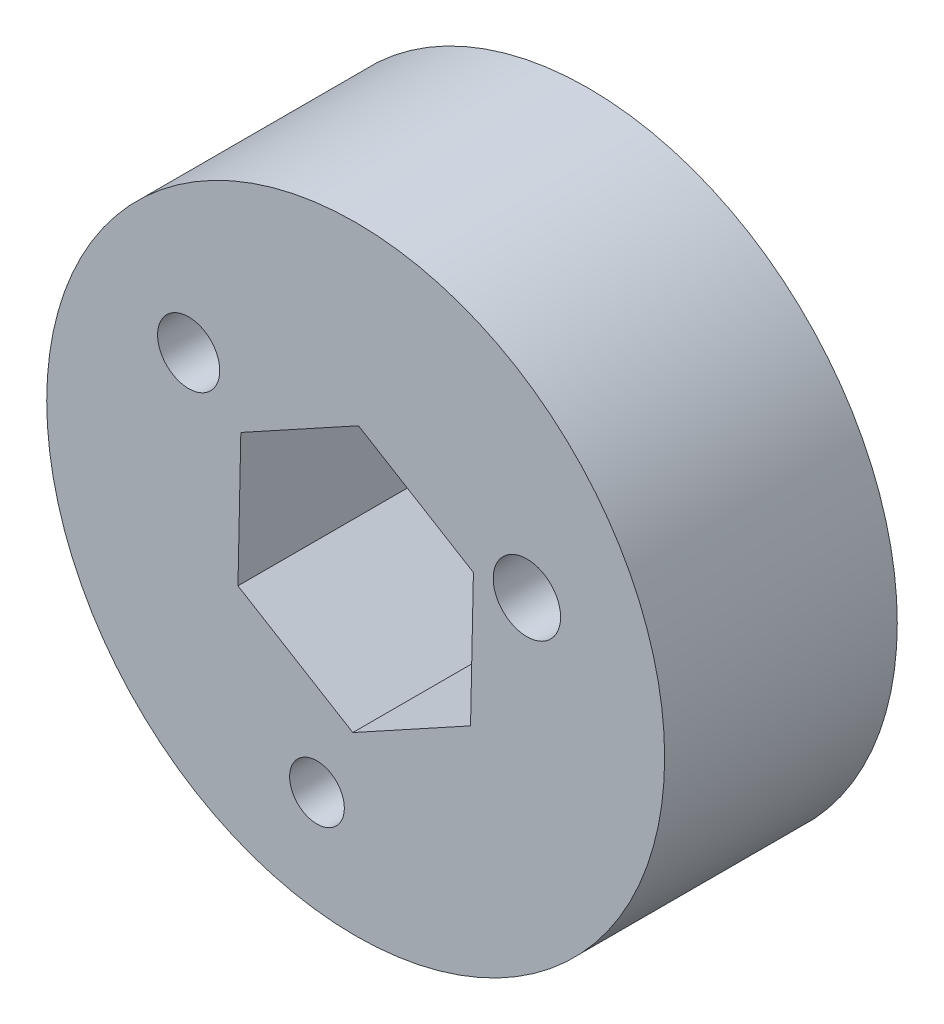
ISO-10303-21;
HEADER;
FILE_DESCRIPTION(('STEP AP214'),'2;1');
FILE_NAME('part.step','',(''),(''),'','','');
FILE_SCHEMA(('AUTOMOTIVE_DESIGN { 1 0 10303 214 1 1 1 1 }'));
ENDSEC;
DATA;
#1=APPLICATION_CONTEXT('core data for automotive mechanical design processes');
#2=APPLICATION_PROTOCOL_DEFINITION('international standard','automotive_design',2000,#1);
#3=PRODUCT_CONTEXT('',#1,'mechanical');
#4=PRODUCT('Part','Part','',(#3));
#5=PRODUCT_RELATED_PRODUCT_CATEGORY('part','',(#4));
#6=PRODUCT_DEFINITION_FORMATION('','',#4);
#7=PRODUCT_DEFINITION_CONTEXT('part definition',#1,'design');
#8=PRODUCT_DEFINITION('design','',#6,#7);
#9=PRODUCT_DEFINITION_SHAPE('','',#8);
#10=(LENGTH_UNIT() NAMED_UNIT(*) SI_UNIT(.MILLI.,.METRE.));
#11=(NAMED_UNIT(*) PLANE_ANGLE_UNIT() SI_UNIT($,.RADIAN.));
#12=(NAMED_UNIT(*) SI_UNIT($,.STERADIAN.) SOLID_ANGLE_UNIT());
#13=UNCERTAINTY_MEASURE_WITH_UNIT(LENGTH_MEASURE(1.E-05),#10,'distance_accuracy_value','');
#14=(GEOMETRIC_REPRESENTATION_CONTEXT(3) GLOBAL_UNCERTAINTY_ASSIGNED_CONTEXT((#13)) GLOBAL_UNIT_ASSIGNED_CONTEXT((#10,
#11,#12)) REPRESENTATION_CONTEXT('',''));
#15=CARTESIAN_POINT('',(0.,0.,0.));
#16=DIRECTION('',(0.,0.,1.));
#17=DIRECTION('',(1.,0.,0.));
#18=AXIS2_PLACEMENT_3D('',#15,#16,#17);
#19=CARTESIAN_POINT('',(0.,0.,12.7));
#20=DIRECTION('',(0.,0.,1.));
#21=DIRECTION('',(1.,0.,0.));
#22=AXIS2_PLACEMENT_3D('',#19,#20,#21);
#23=PLANE('',#22);
#24=CARTESIAN_POINT('',(9.34717125306861,3.79198915274515,12.7));
#25=DIRECTION('',(0.,0.,1.));
#26=DIRECTION('',(1.,0.,0.));
#27=AXIS2_PLACEMENT_3D('',#24,#25,#26);
#28=CIRCLE('',#27,1.83939433320099);
#29=CARTESIAN_POINT('',(11.1865655862696,3.79198915274515,12.7));
#30=VERTEX_POINT('',#29);
#31=EDGE_CURVE('E143',#30,#30,#28,.T.);
#32=ORIENTED_EDGE('',*,*,#31,.F.);
#33=EDGE_LOOP('',(#32));
#34=FACE_BOUND('',#33,.T.);
#35=CARTESIAN_POINT('',(0.,0.,12.7));
#36=DIRECTION('',(0.,0.,1.));
#37=DIRECTION('',(1.,0.,0.));
#38=AXIS2_PLACEMENT_3D('',#35,#36,#37);
#39=CIRCLE('',#38,16.8678829197652);
#40=CARTESIAN_POINT('',(16.8678829197652,0.,12.7));
#41=VERTEX_POINT('',#40);
#42=EDGE_CURVE('E11',#41,#41,#39,.T.);
#43=ORIENTED_EDGE('',*,*,#42,.T.);
#44=EDGE_LOOP('',(#43));
#45=FACE_BOUND('',#44,.T.);
#46=CARTESIAN_POINT('',(-9.11889125228527,6.14587946586198,12.7));
#47=DIRECTION('',(0.,0.,1.));
#48=DIRECTION('',(1.,0.,0.));
#49=AXIS2_PLACEMENT_3D('',#46,#47,#48);
#50=CIRCLE('',#49,1.69764029775843);
#51=CARTESIAN_POINT('',(-7.42125095452684,6.14587946586198,12.7));
#52=VERTEX_POINT('',#51);
#53=EDGE_CURVE('E149',#52,#52,#50,.T.);
#54=ORIENTED_EDGE('',*,*,#53,.F.);
#55=EDGE_LOOP('',(#54));
#56=FACE_BOUND('',#55,.T.);
#57=CARTESIAN_POINT('',(-2.1134113956407,-11.1402832279168,12.7));
#58=DIRECTION('',(0.,0.,1.));
#59=DIRECTION('',(1.,0.,0.));
#60=AXIS2_PLACEMENT_3D('',#57,#58,#59);
#61=CIRCLE('',#60,1.49408993531548);
#62=CARTESIAN_POINT('',(-0.619321460325215,-11.1402832279168,12.7));
#63=VERTEX_POINT('',#62);
#64=EDGE_CURVE('E137',#63,#63,#61,.T.);
#65=ORIENTED_EDGE('',*,*,#64,.F.);
#66=EDGE_LOOP('',(#65));
#67=FACE_BOUND('',#66,.T.);
#68=DIRECTION('',(0.855146963541518,-0.518385639023422,0.));
#69=VECTOR('',#68,1.);
#70=CARTESIAN_POINT('',(-0.156631064855326,-7.33067527877586,12.7));
#71=LINE('',#70,#69);
#72=CARTESIAN_POINT('',(-6.42686655074213,-3.52969115820141,12.7));
#73=VERTEX_POINT('',#72);
#74=CARTESIAN_POINT('',(-0.156631064855326,-7.33067527877586,12.7));
#75=VERTEX_POINT('',#74);
#76=EDGE_CURVE('E94',#73,#75,#71,.T.);
#77=ORIENTED_EDGE('',*,*,#76,.F.);
#78=DIRECTION('',(-0.0213616505805544,-0.999771813907791,0.));
#79=VECTOR('',#78,1.);
#80=CARTESIAN_POINT('',(-6.42686655074213,-3.52969115820141,12.7));
#81=LINE('',#80,#79);
#82=CARTESIAN_POINT('',(-6.27023548588681,3.80098412057446,12.7));
#83=VERTEX_POINT('',#82);
#84=EDGE_CURVE('E86',#83,#73,#81,.T.);
#85=ORIENTED_EDGE('',*,*,#84,.F.);
#86=DIRECTION('',(-0.876508614122073,-0.481386174884368,0.));
#87=VECTOR('',#86,1.);
#88=CARTESIAN_POINT('',(-6.27023548588681,3.80098412057446,12.7));
#89=LINE('',#88,#87);
#90=CARTESIAN_POINT('',(0.156631064855326,7.33067527877586,12.7));
#91=VERTEX_POINT('',#90);
#92=EDGE_CURVE('E115',#91,#83,#89,.T.);
#93=ORIENTED_EDGE('',*,*,#92,.F.);
#94=DIRECTION('',(-0.855146963541518,0.518385639023422,0.));
#95=VECTOR('',#94,1.);
#96=CARTESIAN_POINT('',(0.156631064855326,7.33067527877586,12.7));
#97=LINE('',#96,#95);
#98=CARTESIAN_POINT('',(6.42686655074214,3.52969115820141,12.7));
#99=VERTEX_POINT('',#98);
#100=EDGE_CURVE('E113',#99,#91,#97,.T.);
#101=ORIENTED_EDGE('',*,*,#100,.F.);
#102=DIRECTION('',(0.0213616505805546,0.999771813907791,0.));
#103=VECTOR('',#102,1.);
#104=CARTESIAN_POINT('',(6.42686655074214,3.52969115820141,12.7));
#105=LINE('',#104,#103);
#106=CARTESIAN_POINT('',(6.27023548588681,-3.80098412057446,12.7));
#107=VERTEX_POINT('',#106);
#108=EDGE_CURVE('E109',#107,#99,#105,.T.);
#109=ORIENTED_EDGE('',*,*,#108,.F.);
#110=DIRECTION('',(0.876508614122072,0.481386174884369,0.));
#111=VECTOR('',#110,1.);
#112=CARTESIAN_POINT('',(6.27023548588681,-3.80098412057446,12.7));
#113=LINE('',#112,#111);
#114=EDGE_CURVE('E107',#75,#107,#113,.T.);
#115=ORIENTED_EDGE('',*,*,#114,.F.);
#116=EDGE_LOOP('',(#77,#85,#93,#101,#109,#115));
#117=FACE_BOUND('',#116,.T.);
#118=ADVANCED_FACE('F33',(#34,#45,#56,#67,#117),#23,.T.);
#119=CARTESIAN_POINT('',(0.,0.,0.));
#120=DIRECTION('',(0.,0.,1.));
#121=DIRECTION('',(1.,0.,0.));
#122=AXIS2_PLACEMENT_3D('',#119,#120,#121);
#123=PLANE('',#122);
#124=CARTESIAN_POINT('',(-2.1134113956407,-11.1402832279168,0.));
#125=DIRECTION('',(0.,0.,1.));
#126=DIRECTION('',(1.,0.,0.));
#127=AXIS2_PLACEMENT_3D('',#124,#125,#126);
#128=CIRCLE('',#127,1.49408993531548);
#129=CARTESIAN_POINT('',(-0.619321460325215,-11.1402832279168,0.));
#130=VERTEX_POINT('',#129);
#131=EDGE_CURVE('E102',#130,#130,#128,.T.);
#132=ORIENTED_EDGE('',*,*,#131,.T.);
#133=EDGE_LOOP('',(#132));
#134=FACE_BOUND('',#133,.T.);
#135=CARTESIAN_POINT('',(9.34717125306861,3.79198915274515,0.));
#136=DIRECTION('',(0.,0.,1.));
#137=DIRECTION('',(1.,0.,0.));
#138=AXIS2_PLACEMENT_3D('',#135,#136,#137);
#139=CIRCLE('',#138,1.83939433320099);
#140=CARTESIAN_POINT('',(11.1865655862696,3.79198915274515,0.));
#141=VERTEX_POINT('',#140);
#142=EDGE_CURVE('E140',#141,#141,#139,.T.);
#143=ORIENTED_EDGE('',*,*,#142,.T.);
#144=EDGE_LOOP('',(#143));
#145=FACE_BOUND('',#144,.T.);
#146=CARTESIAN_POINT('',(-9.11889125228527,6.14587946586198,0.));
#147=DIRECTION('',(0.,0.,1.));
#148=DIRECTION('',(1.,0.,0.));
#149=AXIS2_PLACEMENT_3D('',#146,#147,#148);
#150=CIRCLE('',#149,1.69764029775843);
#151=CARTESIAN_POINT('',(-7.42125095452684,6.14587946586198,0.));
#152=VERTEX_POINT('',#151);
#153=EDGE_CURVE('E146',#152,#152,#150,.T.);
#154=ORIENTED_EDGE('',*,*,#153,.T.);
#155=EDGE_LOOP('',(#154));
#156=FACE_BOUND('',#155,.T.);
#157=CARTESIAN_POINT('',(0.,0.,0.));
#158=DIRECTION('',(0.,0.,1.));
#159=DIRECTION('',(1.,0.,0.));
#160=AXIS2_PLACEMENT_3D('',#157,#158,#159);
#161=CIRCLE('',#160,16.8678829197652);
#162=CARTESIAN_POINT('',(16.8678829197652,0.,0.));
#163=VERTEX_POINT('',#162);
#164=EDGE_CURVE('E37',#163,#163,#161,.T.);
#165=ORIENTED_EDGE('',*,*,#164,.F.);
#166=EDGE_LOOP('',(#165));
#167=FACE_BOUND('',#166,.T.);
#168=DIRECTION('',(-0.0213616505805544,-0.999771813907791,0.));
#169=VECTOR('',#168,1.);
#170=CARTESIAN_POINT('',(-6.42686655074213,-3.52969115820141,0.));
#171=LINE('',#170,#169);
#172=CARTESIAN_POINT('',(-6.27023548588681,3.80098412057446,0.));
#173=VERTEX_POINT('',#172);
#174=CARTESIAN_POINT('',(-6.42686655074213,-3.52969115820141,0.));
#175=VERTEX_POINT('',#174);
#176=EDGE_CURVE('E56',#173,#175,#171,.T.);
#177=ORIENTED_EDGE('',*,*,#176,.T.);
#178=DIRECTION('',(0.855146963541518,-0.518385639023422,0.));
#179=VECTOR('',#178,1.);
#180=CARTESIAN_POINT('',(-0.156631064855326,-7.33067527877586,0.));
#181=LINE('',#180,#179);
#182=CARTESIAN_POINT('',(-0.156631064855326,-7.33067527877586,0.));
#183=VERTEX_POINT('',#182);
#184=EDGE_CURVE('E101',#175,#183,#181,.T.);
#185=ORIENTED_EDGE('',*,*,#184,.T.);
#186=DIRECTION('',(0.876508614122072,0.481386174884369,0.));
#187=VECTOR('',#186,1.);
#188=CARTESIAN_POINT('',(6.27023548588681,-3.80098412057446,0.));
#189=LINE('',#188,#187);
#190=CARTESIAN_POINT('',(6.27023548588681,-3.80098412057446,0.));
#191=VERTEX_POINT('',#190);
#192=EDGE_CURVE('E119',#183,#191,#189,.T.);
#193=ORIENTED_EDGE('',*,*,#192,.T.);
#194=DIRECTION('',(0.0213616505805546,0.999771813907791,0.));
#195=VECTOR('',#194,1.);
#196=CARTESIAN_POINT('',(6.42686655074214,3.52969115820141,0.));
#197=LINE('',#196,#195);
#198=CARTESIAN_POINT('',(6.42686655074214,3.52969115820141,0.));
#199=VERTEX_POINT('',#198);
#200=EDGE_CURVE('E122',#191,#199,#197,.T.);
#201=ORIENTED_EDGE('',*,*,#200,.T.);
#202=DIRECTION('',(-0.855146963541518,0.518385639023422,0.));
#203=VECTOR('',#202,1.);
#204=CARTESIAN_POINT('',(0.156631064855326,7.33067527877586,0.));
#205=LINE('',#204,#203);
#206=CARTESIAN_POINT('',(0.156631064855326,7.33067527877586,0.));
#207=VERTEX_POINT('',#206);
#208=EDGE_CURVE('E125',#199,#207,#205,.T.);
#209=ORIENTED_EDGE('',*,*,#208,.T.);
#210=DIRECTION('',(-0.876508614122073,-0.481386174884368,0.));
#211=VECTOR('',#210,1.);
#212=CARTESIAN_POINT('',(-6.27023548588681,3.80098412057446,0.));
#213=LINE('',#212,#211);
#214=EDGE_CURVE('E95',#207,#173,#213,.T.);
#215=ORIENTED_EDGE('',*,*,#214,.T.);
#216=EDGE_LOOP('',(#177,#185,#193,#201,#209,#215));
#217=FACE_BOUND('',#216,.T.);
#218=ADVANCED_FACE('F155',(#134,#145,#156,#167,#217),#123,.F.);
#219=CARTESIAN_POINT('',(0.,0.,12.7));
#220=DIRECTION('',(0.,0.,-1.));
#221=DIRECTION('',(-1.,0.,0.));
#222=AXIS2_PLACEMENT_3D('',#219,#220,#221);
#223=CYLINDRICAL_SURFACE('',#222,16.8678829197652);
#224=ORIENTED_EDGE('',*,*,#42,.F.);
#225=EDGE_LOOP('',(#224));
#226=FACE_BOUND('',#225,.T.);
#227=ORIENTED_EDGE('',*,*,#164,.T.);
#228=EDGE_LOOP('',(#227));
#229=FACE_BOUND('',#228,.T.);
#230=ADVANCED_FACE('F35',(#226,#229),#223,.T.);
#231=CARTESIAN_POINT('',(-9.11889125228527,6.14587946586198,12.7));
#232=DIRECTION('',(0.,0.,-1.));
#233=DIRECTION('',(-1.,0.,0.));
#234=AXIS2_PLACEMENT_3D('',#231,#232,#233);
#235=CYLINDRICAL_SURFACE('',#234,1.69764029775843);
#236=ORIENTED_EDGE('',*,*,#53,.T.);
#237=EDGE_LOOP('',(#236));
#238=FACE_BOUND('',#237,.T.);
#239=ORIENTED_EDGE('',*,*,#153,.F.);
#240=EDGE_LOOP('',(#239));
#241=FACE_BOUND('',#240,.T.);
#242=ADVANCED_FACE('F158',(#238,#241),#235,.F.);
#243=CARTESIAN_POINT('',(9.34717125306861,3.79198915274515,12.7));
#244=DIRECTION('',(0.,0.,-1.));
#245=DIRECTION('',(-1.,0.,0.));
#246=AXIS2_PLACEMENT_3D('',#243,#244,#245);
#247=CYLINDRICAL_SURFACE('',#246,1.83939433320099);
#248=ORIENTED_EDGE('',*,*,#31,.T.);
#249=EDGE_LOOP('',(#248));
#250=FACE_BOUND('',#249,.T.);
#251=ORIENTED_EDGE('',*,*,#142,.F.);
#252=EDGE_LOOP('',(#251));
#253=FACE_BOUND('',#252,.T.);
#254=ADVANCED_FACE('F160',(#250,#253),#247,.F.);
#255=CARTESIAN_POINT('',(-2.1134113956407,-11.1402832279168,12.7));
#256=DIRECTION('',(0.,0.,-1.));
#257=DIRECTION('',(-1.,0.,0.));
#258=AXIS2_PLACEMENT_3D('',#255,#256,#257);
#259=CYLINDRICAL_SURFACE('',#258,1.49408993531548);
#260=ORIENTED_EDGE('',*,*,#64,.T.);
#261=EDGE_LOOP('',(#260));
#262=FACE_BOUND('',#261,.T.);
#263=ORIENTED_EDGE('',*,*,#131,.F.);
#264=EDGE_LOOP('',(#263));
#265=FACE_BOUND('',#264,.T.);
#266=ADVANCED_FACE('F167',(#262,#265),#259,.F.);
#267=CARTESIAN_POINT('',(-6.42686655074213,-3.52969115820141,12.7));
#268=DIRECTION('',(0.999771813907791,-0.0213616505805544,0.));
#269=DIRECTION('',(0.0213616505805544,0.999771813907791,0.));
#270=AXIS2_PLACEMENT_3D('',#267,#268,#269);
#271=PLANE('',#270);
#272=ORIENTED_EDGE('',*,*,#176,.F.);
#273=DIRECTION('',(0.,0.,-1.));
#274=VECTOR('',#273,1.);
#275=CARTESIAN_POINT('',(-6.27023548588681,3.80098412057446,12.7));
#276=LINE('',#275,#274);
#277=EDGE_CURVE('E90',#83,#173,#276,.T.);
#278=ORIENTED_EDGE('',*,*,#277,.F.);
#279=ORIENTED_EDGE('',*,*,#84,.T.);
#280=DIRECTION('',(0.,0.,-1.));
#281=VECTOR('',#280,1.);
#282=CARTESIAN_POINT('',(-6.42686655074213,-3.52969115820141,12.7));
#283=LINE('',#282,#281);
#284=EDGE_CURVE('E89',#73,#175,#283,.T.);
#285=ORIENTED_EDGE('',*,*,#284,.T.);
#286=EDGE_LOOP('',(#272,#278,#279,#285));
#287=FACE_BOUND('',#286,.T.);
#288=ADVANCED_FACE('F88',(#287),#271,.T.);
#289=CARTESIAN_POINT('',(-0.156631064855326,-7.33067527877586,12.7));
#290=DIRECTION('',(0.518385639023422,0.855146963541518,0.));
#291=DIRECTION('',(-0.855146963541518,0.518385639023422,0.));
#292=AXIS2_PLACEMENT_3D('',#289,#290,#291);
#293=PLANE('',#292);
#294=ORIENTED_EDGE('',*,*,#184,.F.);
#295=ORIENTED_EDGE('',*,*,#284,.F.);
#296=ORIENTED_EDGE('',*,*,#76,.T.);
#297=DIRECTION('',(0.,0.,-1.));
#298=VECTOR('',#297,1.);
#299=CARTESIAN_POINT('',(-0.156631064855326,-7.33067527877586,12.7));
#300=LINE('',#299,#298);
#301=EDGE_CURVE('E103',#75,#183,#300,.T.);
#302=ORIENTED_EDGE('',*,*,#301,.T.);
#303=EDGE_LOOP('',(#294,#295,#296,#302));
#304=FACE_BOUND('',#303,.T.);
#305=ADVANCED_FACE('F98',(#304),#293,.T.);
#306=CARTESIAN_POINT('',(6.27023548588681,-3.80098412057446,12.7));
#307=DIRECTION('',(-0.481386174884368,0.876508614122072,0.));
#308=DIRECTION('',(-0.876508614122073,-0.481386174884369,0.));
#309=AXIS2_PLACEMENT_3D('',#306,#307,#308);
#310=PLANE('',#309);
#311=ORIENTED_EDGE('',*,*,#192,.F.);
#312=ORIENTED_EDGE('',*,*,#301,.F.);
#313=ORIENTED_EDGE('',*,*,#114,.T.);
#314=DIRECTION('',(0.,0.,-1.));
#315=VECTOR('',#314,1.);
#316=CARTESIAN_POINT('',(6.27023548588681,-3.80098412057446,12.7));
#317=LINE('',#316,#315);
#318=EDGE_CURVE('E134',#107,#191,#317,.T.);
#319=ORIENTED_EDGE('',*,*,#318,.T.);
#320=EDGE_LOOP('',(#311,#312,#313,#319));
#321=FACE_BOUND('',#320,.T.);
#322=ADVANCED_FACE('F200',(#321),#310,.T.);
#323=CARTESIAN_POINT('',(6.42686655074214,3.52969115820141,12.7));
#324=DIRECTION('',(-0.999771813907791,0.0213616505805546,0.));
#325=DIRECTION('',(-0.0213616505805546,-0.999771813907791,0.));
#326=AXIS2_PLACEMENT_3D('',#323,#324,#325);
#327=PLANE('',#326);
#328=ORIENTED_EDGE('',*,*,#200,.F.);
#329=ORIENTED_EDGE('',*,*,#318,.F.);
#330=ORIENTED_EDGE('',*,*,#108,.T.);
#331=DIRECTION('',(0.,0.,-1.));
#332=VECTOR('',#331,1.);
#333=CARTESIAN_POINT('',(6.42686655074214,3.52969115820141,12.7));
#334=LINE('',#333,#332);
#335=EDGE_CURVE('E132',#99,#199,#334,.T.);
#336=ORIENTED_EDGE('',*,*,#335,.T.);
#337=EDGE_LOOP('',(#328,#329,#330,#336));
#338=FACE_BOUND('',#337,.T.);
#339=ADVANCED_FACE('F203',(#338),#327,.T.);
#340=CARTESIAN_POINT('',(0.156631064855326,7.33067527877586,12.7));
#341=DIRECTION('',(-0.518385639023422,-0.855146963541518,0.));
#342=DIRECTION('',(0.855146963541518,-0.518385639023422,0.));
#343=AXIS2_PLACEMENT_3D('',#340,#341,#342);
#344=PLANE('',#343);
#345=ORIENTED_EDGE('',*,*,#208,.F.);
#346=ORIENTED_EDGE('',*,*,#335,.F.);
#347=ORIENTED_EDGE('',*,*,#100,.T.);
#348=DIRECTION('',(0.,0.,-1.));
#349=VECTOR('',#348,1.);
#350=CARTESIAN_POINT('',(0.156631064855326,7.33067527877586,12.7));
#351=LINE('',#350,#349);
#352=EDGE_CURVE('E48',#91,#207,#351,.T.);
#353=ORIENTED_EDGE('',*,*,#352,.T.);
#354=EDGE_LOOP('',(#345,#346,#347,#353));
#355=FACE_BOUND('',#354,.T.);
#356=ADVANCED_FACE('F207',(#355),#344,.T.);
#357=CARTESIAN_POINT('',(-6.27023548588681,3.80098412057446,12.7));
#358=DIRECTION('',(0.481386174884368,-0.876508614122072,0.));
#359=DIRECTION('',(0.876508614122073,0.481386174884369,0.));
#360=AXIS2_PLACEMENT_3D('',#357,#358,#359);
#361=PLANE('',#360);
#362=ORIENTED_EDGE('',*,*,#214,.F.);
#363=ORIENTED_EDGE('',*,*,#352,.F.);
#364=ORIENTED_EDGE('',*,*,#92,.T.);
#365=ORIENTED_EDGE('',*,*,#277,.T.);
#366=EDGE_LOOP('',(#362,#363,#364,#365));
#367=FACE_BOUND('',#366,.T.);
#368=ADVANCED_FACE('F211',(#367),#361,.T.);
#369=CLOSED_SHELL('',(#118,#218,#230,#242,#254,#266,#288,#305,#322,#339,#356,#368));
#370=MANIFOLD_SOLID_BREP('B2',#369);
#371=ADVANCED_BREP_SHAPE_REPRESENTATION('',(#18,#370),#14);
#372=SHAPE_DEFINITION_REPRESENTATION(#9,#371);
ENDSEC;
END-ISO-10303-21;
